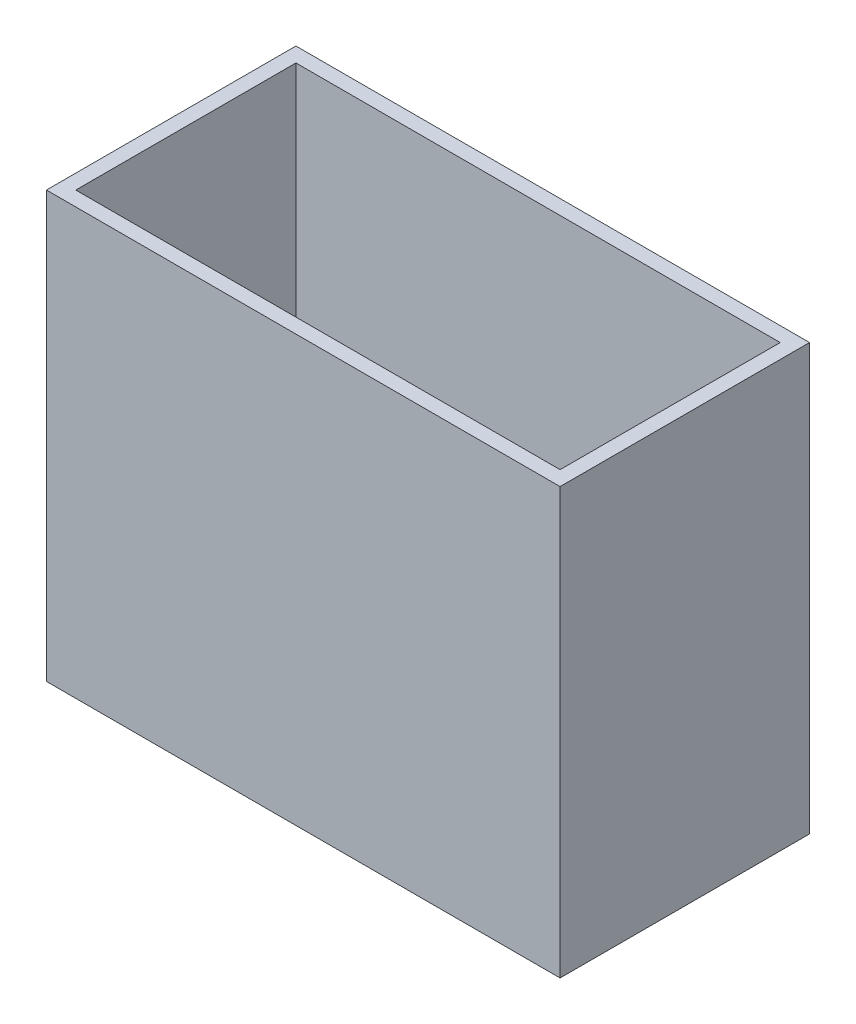
ISO-10303-21;
HEADER;
FILE_DESCRIPTION(('STEP AP214'),'2;1');
FILE_NAME('part.step','',(''),(''),'','','');
FILE_SCHEMA(('AUTOMOTIVE_DESIGN { 1 0 10303 214 1 1 1 1 }'));
ENDSEC;
DATA;
#1=APPLICATION_CONTEXT('core data for automotive mechanical design processes');
#2=APPLICATION_PROTOCOL_DEFINITION('international standard','automotive_design',2000,#1);
#3=PRODUCT_CONTEXT('',#1,'mechanical');
#4=PRODUCT('Part','Part','',(#3));
#5=PRODUCT_RELATED_PRODUCT_CATEGORY('part','',(#4));
#6=PRODUCT_DEFINITION_FORMATION('','',#4);
#7=PRODUCT_DEFINITION_CONTEXT('part definition',#1,'design');
#8=PRODUCT_DEFINITION('design','',#6,#7);
#9=PRODUCT_DEFINITION_SHAPE('','',#8);
#10=(LENGTH_UNIT() NAMED_UNIT(*) SI_UNIT(.MILLI.,.METRE.));
#11=(NAMED_UNIT(*) PLANE_ANGLE_UNIT() SI_UNIT($,.RADIAN.));
#12=(NAMED_UNIT(*) SI_UNIT($,.STERADIAN.) SOLID_ANGLE_UNIT());
#13=UNCERTAINTY_MEASURE_WITH_UNIT(LENGTH_MEASURE(1.E-05),#10,'distance_accuracy_value','');
#14=(GEOMETRIC_REPRESENTATION_CONTEXT(3) GLOBAL_UNCERTAINTY_ASSIGNED_CONTEXT((#13)) GLOBAL_UNIT_ASSIGNED_CONTEXT((#10,
#11,#12)) REPRESENTATION_CONTEXT('',''));
#15=CARTESIAN_POINT('',(0.,0.,0.));
#16=DIRECTION('',(0.,0.,1.));
#17=DIRECTION('',(1.,0.,0.));
#18=AXIS2_PLACEMENT_3D('',#15,#16,#17);
#19=CARTESIAN_POINT('',(0.,58.,0.));
#20=DIRECTION('',(-1.,0.,0.));
#21=DIRECTION('',(0.,0.,1.));
#22=AXIS2_PLACEMENT_3D('',#19,#20,#21);
#23=PLANE('',#22);
#24=DIRECTION('',(0.,0.,-1.));
#25=VECTOR('',#24,1.);
#26=CARTESIAN_POINT('',(0.,0.,0.));
#27=LINE('',#26,#25);
#28=CARTESIAN_POINT('',(0.,0.,34.));
#29=VERTEX_POINT('',#28);
#30=CARTESIAN_POINT('',(0.,0.,0.));
#31=VERTEX_POINT('',#30);
#32=EDGE_CURVE('E183',#29,#31,#27,.T.);
#33=ORIENTED_EDGE('',*,*,#32,.T.);
#34=DIRECTION('',(0.,-1.,0.));
#35=VECTOR('',#34,1.);
#36=CARTESIAN_POINT('',(0.,58.,0.));
#37=LINE('',#36,#35);
#38=CARTESIAN_POINT('',(0.,58.,0.));
#39=VERTEX_POINT('',#38);
#40=EDGE_CURVE('E11',#39,#31,#37,.T.);
#41=ORIENTED_EDGE('',*,*,#40,.F.);
#42=DIRECTION('',(0.,0.,-1.));
#43=VECTOR('',#42,1.);
#44=CARTESIAN_POINT('',(0.,58.,0.));
#45=LINE('',#44,#43);
#46=CARTESIAN_POINT('',(0.,58.,34.));
#47=VERTEX_POINT('',#46);
#48=EDGE_CURVE('E190',#47,#39,#45,.T.);
#49=ORIENTED_EDGE('',*,*,#48,.F.);
#50=DIRECTION('',(0.,-1.,0.));
#51=VECTOR('',#50,1.);
#52=CARTESIAN_POINT('',(0.,58.,34.));
#53=LINE('',#52,#51);
#54=EDGE_CURVE('E200',#47,#29,#53,.T.);
#55=ORIENTED_EDGE('',*,*,#54,.T.);
#56=EDGE_LOOP('',(#33,#41,#49,#55));
#57=FACE_BOUND('',#56,.T.);
#58=ADVANCED_FACE('F33',(#57),#23,.F.);
#59=CARTESIAN_POINT('',(0.,58.,0.));
#60=DIRECTION('',(0.,0.,1.));
#61=DIRECTION('',(1.,0.,0.));
#62=AXIS2_PLACEMENT_3D('',#59,#60,#61);
#63=PLANE('',#62);
#64=DIRECTION('',(-1.,0.,0.));
#65=VECTOR('',#64,1.);
#66=CARTESIAN_POINT('',(0.,0.,0.));
#67=LINE('',#66,#65);
#68=CARTESIAN_POINT('',(-70.,0.,0.));
#69=VERTEX_POINT('',#68);
#70=EDGE_CURVE('E203',#31,#69,#67,.T.);
#71=ORIENTED_EDGE('',*,*,#70,.T.);
#72=DIRECTION('',(0.,-1.,0.));
#73=VECTOR('',#72,1.);
#74=CARTESIAN_POINT('',(-70.,58.,0.));
#75=LINE('',#74,#73);
#76=CARTESIAN_POINT('',(-70.,58.,0.));
#77=VERTEX_POINT('',#76);
#78=EDGE_CURVE('E40',#77,#69,#75,.T.);
#79=ORIENTED_EDGE('',*,*,#78,.F.);
#80=DIRECTION('',(-1.,0.,0.));
#81=VECTOR('',#80,1.);
#82=CARTESIAN_POINT('',(0.,58.,0.));
#83=LINE('',#82,#81);
#84=EDGE_CURVE('E193',#39,#77,#83,.T.);
#85=ORIENTED_EDGE('',*,*,#84,.F.);
#86=ORIENTED_EDGE('',*,*,#40,.T.);
#87=EDGE_LOOP('',(#71,#79,#85,#86));
#88=FACE_BOUND('',#87,.T.);
#89=ADVANCED_FACE('F231',(#88),#63,.F.);
#90=CARTESIAN_POINT('',(-70.,58.,0.));
#91=DIRECTION('',(1.,0.,0.));
#92=DIRECTION('',(0.,0.,-1.));
#93=AXIS2_PLACEMENT_3D('',#90,#91,#92);
#94=PLANE('',#93);
#95=DIRECTION('',(0.,0.,1.));
#96=VECTOR('',#95,1.);
#97=CARTESIAN_POINT('',(-70.,0.,0.));
#98=LINE('',#97,#96);
#99=CARTESIAN_POINT('',(-70.,0.,34.));
#100=VERTEX_POINT('',#99);
#101=EDGE_CURVE('E205',#69,#100,#98,.T.);
#102=ORIENTED_EDGE('',*,*,#101,.T.);
#103=DIRECTION('',(0.,-1.,0.));
#104=VECTOR('',#103,1.);
#105=CARTESIAN_POINT('',(-70.,58.,34.));
#106=LINE('',#105,#104);
#107=CARTESIAN_POINT('',(-70.,58.,34.));
#108=VERTEX_POINT('',#107);
#109=EDGE_CURVE('E210',#108,#100,#106,.T.);
#110=ORIENTED_EDGE('',*,*,#109,.F.);
#111=DIRECTION('',(0.,0.,1.));
#112=VECTOR('',#111,1.);
#113=CARTESIAN_POINT('',(-70.,58.,0.));
#114=LINE('',#113,#112);
#115=EDGE_CURVE('E196',#77,#108,#114,.T.);
#116=ORIENTED_EDGE('',*,*,#115,.F.);
#117=ORIENTED_EDGE('',*,*,#78,.T.);
#118=EDGE_LOOP('',(#102,#110,#116,#117));
#119=FACE_BOUND('',#118,.T.);
#120=ADVANCED_FACE('F217',(#119),#94,.F.);
#121=CARTESIAN_POINT('',(0.,58.,34.));
#122=DIRECTION('',(0.,0.,-1.));
#123=DIRECTION('',(-1.,0.,0.));
#124=AXIS2_PLACEMENT_3D('',#121,#122,#123);
#125=PLANE('',#124);
#126=DIRECTION('',(1.,0.,0.));
#127=VECTOR('',#126,1.);
#128=CARTESIAN_POINT('',(0.,0.,34.));
#129=LINE('',#128,#127);
#130=EDGE_CURVE('E194',#100,#29,#129,.T.);
#131=ORIENTED_EDGE('',*,*,#130,.T.);
#132=ORIENTED_EDGE('',*,*,#54,.F.);
#133=DIRECTION('',(1.,0.,0.));
#134=VECTOR('',#133,1.);
#135=CARTESIAN_POINT('',(0.,58.,34.));
#136=LINE('',#135,#134);
#137=EDGE_CURVE('E198',#108,#47,#136,.T.);
#138=ORIENTED_EDGE('',*,*,#137,.F.);
#139=ORIENTED_EDGE('',*,*,#109,.T.);
#140=EDGE_LOOP('',(#131,#132,#138,#139));
#141=FACE_BOUND('',#140,.T.);
#142=ADVANCED_FACE('F224',(#141),#125,.F.);
#143=CARTESIAN_POINT('',(0.,58.,0.));
#144=DIRECTION('',(0.,-1.,0.));
#145=DIRECTION('',(0.,0.,-1.));
#146=AXIS2_PLACEMENT_3D('',#143,#144,#145);
#147=PLANE('',#146);
#148=DIRECTION('',(1.,0.,0.));
#149=VECTOR('',#148,1.);
#150=CARTESIAN_POINT('',(-68.,58.,32.));
#151=LINE('',#150,#149);
#152=CARTESIAN_POINT('',(-68.,58.,32.));
#153=VERTEX_POINT('',#152);
#154=CARTESIAN_POINT('',(-2.,58.,32.));
#155=VERTEX_POINT('',#154);
#156=EDGE_CURVE('E173',#153,#155,#151,.T.);
#157=ORIENTED_EDGE('',*,*,#156,.F.);
#158=DIRECTION('',(0.,0.,1.));
#159=VECTOR('',#158,1.);
#160=CARTESIAN_POINT('',(-68.,58.,2.));
#161=LINE('',#160,#159);
#162=CARTESIAN_POINT('',(-68.,58.,2.));
#163=VERTEX_POINT('',#162);
#164=EDGE_CURVE('E154',#163,#153,#161,.T.);
#165=ORIENTED_EDGE('',*,*,#164,.F.);
#166=DIRECTION('',(-1.,0.,0.));
#167=VECTOR('',#166,1.);
#168=CARTESIAN_POINT('',(-68.,58.,2.));
#169=LINE('',#168,#167);
#170=CARTESIAN_POINT('',(-2.,58.,2.));
#171=VERTEX_POINT('',#170);
#172=EDGE_CURVE('E162',#171,#163,#169,.T.);
#173=ORIENTED_EDGE('',*,*,#172,.F.);
#174=DIRECTION('',(0.,0.,-1.));
#175=VECTOR('',#174,1.);
#176=CARTESIAN_POINT('',(-2.,58.,2.));
#177=LINE('',#176,#175);
#178=EDGE_CURVE('E176',#155,#171,#177,.T.);
#179=ORIENTED_EDGE('',*,*,#178,.F.);
#180=EDGE_LOOP('',(#157,#165,#173,#179));
#181=FACE_BOUND('',#180,.T.);
#182=ORIENTED_EDGE('',*,*,#48,.T.);
#183=ORIENTED_EDGE('',*,*,#84,.T.);
#184=ORIENTED_EDGE('',*,*,#115,.T.);
#185=ORIENTED_EDGE('',*,*,#137,.T.);
#186=EDGE_LOOP('',(#182,#183,#184,#185));
#187=FACE_BOUND('',#186,.T.);
#188=ADVANCED_FACE('F230',(#181,#187),#147,.F.);
#189=CARTESIAN_POINT('',(0.,0.,0.));
#190=DIRECTION('',(0.,-1.,0.));
#191=DIRECTION('',(0.,0.,-1.));
#192=AXIS2_PLACEMENT_3D('',#189,#190,#191);
#193=PLANE('',#192);
#194=DIRECTION('',(0.,0.,1.));
#195=VECTOR('',#194,1.);
#196=CARTESIAN_POINT('',(-56.,0.,7.));
#197=LINE('',#196,#195);
#198=CARTESIAN_POINT('',(-56.,0.,7.));
#199=VERTEX_POINT('',#198);
#200=CARTESIAN_POINT('',(-56.,0.,27.));
#201=VERTEX_POINT('',#200);
#202=EDGE_CURVE('E123',#199,#201,#197,.T.);
#203=ORIENTED_EDGE('',*,*,#202,.T.);
#204=DIRECTION('',(1.,0.,0.));
#205=VECTOR('',#204,1.);
#206=CARTESIAN_POINT('',(-56.,0.,27.));
#207=LINE('',#206,#205);
#208=CARTESIAN_POINT('',(-32.,0.,27.));
#209=VERTEX_POINT('',#208);
#210=EDGE_CURVE('E132',#201,#209,#207,.T.);
#211=ORIENTED_EDGE('',*,*,#210,.T.);
#212=DIRECTION('',(0.,0.,-1.));
#213=VECTOR('',#212,1.);
#214=CARTESIAN_POINT('',(-32.,0.,7.));
#215=LINE('',#214,#213);
#216=CARTESIAN_POINT('',(-32.,0.,7.));
#217=VERTEX_POINT('',#216);
#218=EDGE_CURVE('E47',#209,#217,#215,.T.);
#219=ORIENTED_EDGE('',*,*,#218,.T.);
#220=DIRECTION('',(-1.,0.,0.));
#221=VECTOR('',#220,1.);
#222=CARTESIAN_POINT('',(-56.,0.,7.));
#223=LINE('',#222,#221);
#224=EDGE_CURVE('E129',#217,#199,#223,.T.);
#225=ORIENTED_EDGE('',*,*,#224,.T.);
#226=EDGE_LOOP('',(#203,#211,#219,#225));
#227=FACE_BOUND('',#226,.T.);
#228=ORIENTED_EDGE('',*,*,#32,.F.);
#229=ORIENTED_EDGE('',*,*,#130,.F.);
#230=ORIENTED_EDGE('',*,*,#101,.F.);
#231=ORIENTED_EDGE('',*,*,#70,.F.);
#232=EDGE_LOOP('',(#228,#229,#230,#231));
#233=FACE_BOUND('',#232,.T.);
#234=ADVANCED_FACE('F136',(#227,#233),#193,.T.);
#235=CARTESIAN_POINT('',(-68.,2.,2.));
#236=DIRECTION('',(-1.,0.,0.));
#237=DIRECTION('',(0.,0.,1.));
#238=AXIS2_PLACEMENT_3D('',#235,#236,#237);
#239=PLANE('',#238);
#240=ORIENTED_EDGE('',*,*,#164,.T.);
#241=DIRECTION('',(0.,1.,0.));
#242=VECTOR('',#241,1.);
#243=CARTESIAN_POINT('',(-68.,2.,32.));
#244=LINE('',#243,#242);
#245=CARTESIAN_POINT('',(-68.,2.,32.));
#246=VERTEX_POINT('',#245);
#247=EDGE_CURVE('E171',#246,#153,#244,.T.);
#248=ORIENTED_EDGE('',*,*,#247,.F.);
#249=DIRECTION('',(0.,0.,1.));
#250=VECTOR('',#249,1.);
#251=CARTESIAN_POINT('',(-68.,2.,2.));
#252=LINE('',#251,#250);
#253=CARTESIAN_POINT('',(-68.,2.,2.));
#254=VERTEX_POINT('',#253);
#255=EDGE_CURVE('E158',#254,#246,#252,.T.);
#256=ORIENTED_EDGE('',*,*,#255,.F.);
#257=DIRECTION('',(0.,1.,0.));
#258=VECTOR('',#257,1.);
#259=CARTESIAN_POINT('',(-68.,2.,2.));
#260=LINE('',#259,#258);
#261=EDGE_CURVE('E181',#254,#163,#260,.T.);
#262=ORIENTED_EDGE('',*,*,#261,.T.);
#263=EDGE_LOOP('',(#240,#248,#256,#262));
#264=FACE_BOUND('',#263,.T.);
#265=ADVANCED_FACE('F243',(#264),#239,.F.);
#266=CARTESIAN_POINT('',(-68.,2.,2.));
#267=DIRECTION('',(0.,0.,-1.));
#268=DIRECTION('',(-1.,0.,0.));
#269=AXIS2_PLACEMENT_3D('',#266,#267,#268);
#270=PLANE('',#269);
#271=ORIENTED_EDGE('',*,*,#172,.T.);
#272=ORIENTED_EDGE('',*,*,#261,.F.);
#273=DIRECTION('',(-1.,0.,0.));
#274=VECTOR('',#273,1.);
#275=CARTESIAN_POINT('',(-68.,2.,2.));
#276=LINE('',#275,#274);
#277=CARTESIAN_POINT('',(-2.,2.,2.));
#278=VERTEX_POINT('',#277);
#279=EDGE_CURVE('E168',#278,#254,#276,.T.);
#280=ORIENTED_EDGE('',*,*,#279,.F.);
#281=DIRECTION('',(0.,1.,0.));
#282=VECTOR('',#281,1.);
#283=CARTESIAN_POINT('',(-2.,2.,2.));
#284=LINE('',#283,#282);
#285=EDGE_CURVE('E184',#278,#171,#284,.T.);
#286=ORIENTED_EDGE('',*,*,#285,.T.);
#287=EDGE_LOOP('',(#271,#272,#280,#286));
#288=FACE_BOUND('',#287,.T.);
#289=ADVANCED_FACE('F249',(#288),#270,.F.);
#290=CARTESIAN_POINT('',(-2.,2.,2.));
#291=DIRECTION('',(1.,0.,0.));
#292=DIRECTION('',(0.,0.,-1.));
#293=AXIS2_PLACEMENT_3D('',#290,#291,#292);
#294=PLANE('',#293);
#295=ORIENTED_EDGE('',*,*,#178,.T.);
#296=ORIENTED_EDGE('',*,*,#285,.F.);
#297=DIRECTION('',(0.,0.,-1.));
#298=VECTOR('',#297,1.);
#299=CARTESIAN_POINT('',(-2.,2.,2.));
#300=LINE('',#299,#298);
#301=CARTESIAN_POINT('',(-2.,2.,32.));
#302=VERTEX_POINT('',#301);
#303=EDGE_CURVE('E165',#302,#278,#300,.T.);
#304=ORIENTED_EDGE('',*,*,#303,.F.);
#305=DIRECTION('',(0.,1.,0.));
#306=VECTOR('',#305,1.);
#307=CARTESIAN_POINT('',(-2.,2.,32.));
#308=LINE('',#307,#306);
#309=EDGE_CURVE('E186',#302,#155,#308,.T.);
#310=ORIENTED_EDGE('',*,*,#309,.T.);
#311=EDGE_LOOP('',(#295,#296,#304,#310));
#312=FACE_BOUND('',#311,.T.);
#313=ADVANCED_FACE('F255',(#312),#294,.F.);
#314=CARTESIAN_POINT('',(-68.,2.,32.));
#315=DIRECTION('',(0.,0.,1.));
#316=DIRECTION('',(1.,0.,0.));
#317=AXIS2_PLACEMENT_3D('',#314,#315,#316);
#318=PLANE('',#317);
#319=ORIENTED_EDGE('',*,*,#156,.T.);
#320=ORIENTED_EDGE('',*,*,#309,.F.);
#321=DIRECTION('',(1.,0.,0.));
#322=VECTOR('',#321,1.);
#323=CARTESIAN_POINT('',(-68.,2.,32.));
#324=LINE('',#323,#322);
#325=EDGE_CURVE('E161',#246,#302,#324,.T.);
#326=ORIENTED_EDGE('',*,*,#325,.F.);
#327=ORIENTED_EDGE('',*,*,#247,.T.);
#328=EDGE_LOOP('',(#319,#320,#326,#327));
#329=FACE_BOUND('',#328,.T.);
#330=ADVANCED_FACE('F251',(#329),#318,.F.);
#331=CARTESIAN_POINT('',(0.,2.,0.));
#332=DIRECTION('',(0.,1.,0.));
#333=DIRECTION('',(0.,0.,1.));
#334=AXIS2_PLACEMENT_3D('',#331,#332,#333);
#335=PLANE('',#334);
#336=DIRECTION('',(0.,0.,1.));
#337=VECTOR('',#336,1.);
#338=CARTESIAN_POINT('',(-56.,2.,7.));
#339=LINE('',#338,#337);
#340=CARTESIAN_POINT('',(-56.,2.,7.));
#341=VERTEX_POINT('',#340);
#342=CARTESIAN_POINT('',(-56.,2.,27.));
#343=VERTEX_POINT('',#342);
#344=EDGE_CURVE('E55',#341,#343,#339,.T.);
#345=ORIENTED_EDGE('',*,*,#344,.F.);
#346=DIRECTION('',(-1.,0.,0.));
#347=VECTOR('',#346,1.);
#348=CARTESIAN_POINT('',(-56.,2.,7.));
#349=LINE('',#348,#347);
#350=CARTESIAN_POINT('',(-32.,2.,7.));
#351=VERTEX_POINT('',#350);
#352=EDGE_CURVE('E139',#351,#341,#349,.T.);
#353=ORIENTED_EDGE('',*,*,#352,.F.);
#354=DIRECTION('',(0.,0.,-1.));
#355=VECTOR('',#354,1.);
#356=CARTESIAN_POINT('',(-32.,2.,7.));
#357=LINE('',#356,#355);
#358=CARTESIAN_POINT('',(-32.,2.,27.));
#359=VERTEX_POINT('',#358);
#360=EDGE_CURVE('E142',#359,#351,#357,.T.);
#361=ORIENTED_EDGE('',*,*,#360,.F.);
#362=DIRECTION('',(1.,0.,0.));
#363=VECTOR('',#362,1.);
#364=CARTESIAN_POINT('',(-56.,2.,27.));
#365=LINE('',#364,#363);
#366=EDGE_CURVE('E148',#343,#359,#365,.T.);
#367=ORIENTED_EDGE('',*,*,#366,.F.);
#368=EDGE_LOOP('',(#345,#353,#361,#367));
#369=FACE_BOUND('',#368,.T.);
#370=ORIENTED_EDGE('',*,*,#255,.T.);
#371=ORIENTED_EDGE('',*,*,#325,.T.);
#372=ORIENTED_EDGE('',*,*,#303,.T.);
#373=ORIENTED_EDGE('',*,*,#279,.T.);
#374=EDGE_LOOP('',(#370,#371,#372,#373));
#375=FACE_BOUND('',#374,.T.);
#376=ADVANCED_FACE('F254',(#369,#375),#335,.T.);
#377=CARTESIAN_POINT('',(-56.,0.,7.));
#378=DIRECTION('',(-1.,0.,0.));
#379=DIRECTION('',(0.,0.,1.));
#380=AXIS2_PLACEMENT_3D('',#377,#378,#379);
#381=PLANE('',#380);
#382=ORIENTED_EDGE('',*,*,#344,.T.);
#383=DIRECTION('',(0.,1.,0.));
#384=VECTOR('',#383,1.);
#385=CARTESIAN_POINT('',(-56.,0.,27.));
#386=LINE('',#385,#384);
#387=EDGE_CURVE('E119',#201,#343,#386,.T.);
#388=ORIENTED_EDGE('',*,*,#387,.F.);
#389=ORIENTED_EDGE('',*,*,#202,.F.);
#390=DIRECTION('',(0.,1.,0.));
#391=VECTOR('',#390,1.);
#392=CARTESIAN_POINT('',(-56.,0.,7.));
#393=LINE('',#392,#391);
#394=EDGE_CURVE('E152',#199,#341,#393,.T.);
#395=ORIENTED_EDGE('',*,*,#394,.T.);
#396=EDGE_LOOP('',(#382,#388,#389,#395));
#397=FACE_BOUND('',#396,.T.);
#398=ADVANCED_FACE('F121',(#397),#381,.F.);
#399=CARTESIAN_POINT('',(-56.,0.,7.));
#400=DIRECTION('',(0.,0.,-1.));
#401=DIRECTION('',(-1.,0.,0.));
#402=AXIS2_PLACEMENT_3D('',#399,#400,#401);
#403=PLANE('',#402);
#404=ORIENTED_EDGE('',*,*,#352,.T.);
#405=ORIENTED_EDGE('',*,*,#394,.F.);
#406=ORIENTED_EDGE('',*,*,#224,.F.);
#407=DIRECTION('',(0.,1.,0.));
#408=VECTOR('',#407,1.);
#409=CARTESIAN_POINT('',(-32.,0.,7.));
#410=LINE('',#409,#408);
#411=EDGE_CURVE('E155',#217,#351,#410,.T.);
#412=ORIENTED_EDGE('',*,*,#411,.T.);
#413=EDGE_LOOP('',(#404,#405,#406,#412));
#414=FACE_BOUND('',#413,.T.);
#415=ADVANCED_FACE('F268',(#414),#403,.F.);
#416=CARTESIAN_POINT('',(-32.,0.,7.));
#417=DIRECTION('',(1.,0.,0.));
#418=DIRECTION('',(0.,0.,-1.));
#419=AXIS2_PLACEMENT_3D('',#416,#417,#418);
#420=PLANE('',#419);
#421=ORIENTED_EDGE('',*,*,#360,.T.);
#422=ORIENTED_EDGE('',*,*,#411,.F.);
#423=ORIENTED_EDGE('',*,*,#218,.F.);
#424=DIRECTION('',(0.,1.,0.));
#425=VECTOR('',#424,1.);
#426=CARTESIAN_POINT('',(-32.,0.,27.));
#427=LINE('',#426,#425);
#428=EDGE_CURVE('E128',#209,#359,#427,.T.);
#429=ORIENTED_EDGE('',*,*,#428,.T.);
#430=EDGE_LOOP('',(#421,#422,#423,#429));
#431=FACE_BOUND('',#430,.T.);
#432=ADVANCED_FACE('F271',(#431),#420,.F.);
#433=CARTESIAN_POINT('',(-56.,0.,27.));
#434=DIRECTION('',(0.,0.,1.));
#435=DIRECTION('',(1.,0.,0.));
#436=AXIS2_PLACEMENT_3D('',#433,#434,#435);
#437=PLANE('',#436);
#438=ORIENTED_EDGE('',*,*,#366,.T.);
#439=ORIENTED_EDGE('',*,*,#428,.F.);
#440=ORIENTED_EDGE('',*,*,#210,.F.);
#441=ORIENTED_EDGE('',*,*,#387,.T.);
#442=EDGE_LOOP('',(#438,#439,#440,#441));
#443=FACE_BOUND('',#442,.T.);
#444=ADVANCED_FACE('F133',(#443),#437,.F.);
#445=CLOSED_SHELL('',(#58,#89,#120,#142,#188,#234,#265,#289,#313,#330,#376,#398,#415,#432,#444));
#446=MANIFOLD_SOLID_BREP('B2',#445);
#447=ADVANCED_BREP_SHAPE_REPRESENTATION('',(#18,#446),#14);
#448=SHAPE_DEFINITION_REPRESENTATION(#9,#447);
ENDSEC;
END-ISO-10303-21;
